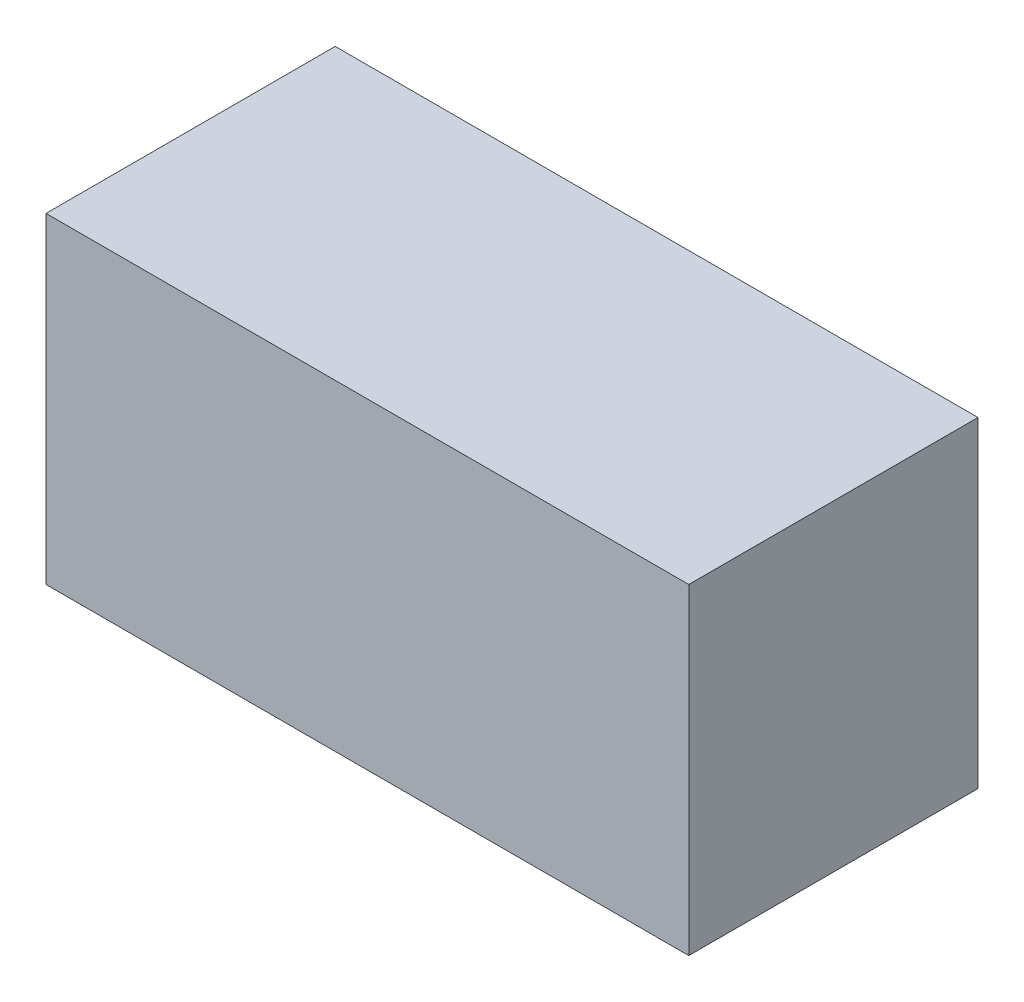
ISO-10303-21;
HEADER;
FILE_DESCRIPTION(('STEP AP214'),'2;1');
FILE_NAME('part.step','',(''),(''),'','','');
FILE_SCHEMA(('AUTOMOTIVE_DESIGN { 1 0 10303 214 1 1 1 1 }'));
ENDSEC;
DATA;
#1=APPLICATION_CONTEXT('core data for automotive mechanical design processes');
#2=APPLICATION_PROTOCOL_DEFINITION('international standard','automotive_design',2000,#1);
#3=PRODUCT_CONTEXT('',#1,'mechanical');
#4=PRODUCT('Part','Part','',(#3));
#5=PRODUCT_RELATED_PRODUCT_CATEGORY('part','',(#4));
#6=PRODUCT_DEFINITION_FORMATION('','',#4);
#7=PRODUCT_DEFINITION_CONTEXT('part definition',#1,'design');
#8=PRODUCT_DEFINITION('design','',#6,#7);
#9=PRODUCT_DEFINITION_SHAPE('','',#8);
#10=(LENGTH_UNIT() NAMED_UNIT(*) SI_UNIT(.MILLI.,.METRE.));
#11=(NAMED_UNIT(*) PLANE_ANGLE_UNIT() SI_UNIT($,.RADIAN.));
#12=(NAMED_UNIT(*) SI_UNIT($,.STERADIAN.) SOLID_ANGLE_UNIT());
#13=UNCERTAINTY_MEASURE_WITH_UNIT(LENGTH_MEASURE(1.E-05),#10,'distance_accuracy_value','');
#14=(GEOMETRIC_REPRESENTATION_CONTEXT(3) GLOBAL_UNCERTAINTY_ASSIGNED_CONTEXT((#13)) GLOBAL_UNIT_ASSIGNED_CONTEXT((#10,
#11,#12)) REPRESENTATION_CONTEXT('',''));
#15=CARTESIAN_POINT('',(0.,0.,0.));
#16=DIRECTION('',(0.,0.,1.));
#17=DIRECTION('',(1.,0.,0.));
#18=AXIS2_PLACEMENT_3D('',#15,#16,#17);
#19=CARTESIAN_POINT('',(1.,-0.5,0.9));
#20=DIRECTION('',(0.,1.,0.));
#21=DIRECTION('',(0.,0.,1.));
#22=AXIS2_PLACEMENT_3D('',#19,#20,#21);
#23=PLANE('',#22);
#24=DIRECTION('',(1.,0.,0.));
#25=VECTOR('',#24,1.);
#26=CARTESIAN_POINT('',(1.,-0.5,0.));
#27=LINE('',#26,#25);
#28=CARTESIAN_POINT('',(-1.,-0.5,0.));
#29=VERTEX_POINT('',#28);
#30=CARTESIAN_POINT('',(1.,-0.5,0.));
#31=VERTEX_POINT('',#30);
#32=EDGE_CURVE('E97',#29,#31,#27,.T.);
#33=ORIENTED_EDGE('',*,*,#32,.T.);
#34=DIRECTION('',(0.,0.,-1.));
#35=VECTOR('',#34,1.);
#36=CARTESIAN_POINT('',(1.,-0.5,0.9));
#37=LINE('',#36,#35);
#38=CARTESIAN_POINT('',(1.,-0.5,0.9));
#39=VERTEX_POINT('',#38);
#40=EDGE_CURVE('E11',#39,#31,#37,.T.);
#41=ORIENTED_EDGE('',*,*,#40,.F.);
#42=DIRECTION('',(1.,0.,0.));
#43=VECTOR('',#42,1.);
#44=CARTESIAN_POINT('',(1.,-0.5,0.9));
#45=LINE('',#44,#43);
#46=CARTESIAN_POINT('',(-1.,-0.5,0.9));
#47=VERTEX_POINT('',#46);
#48=EDGE_CURVE('E85',#47,#39,#45,.T.);
#49=ORIENTED_EDGE('',*,*,#48,.F.);
#50=DIRECTION('',(0.,0.,-1.));
#51=VECTOR('',#50,1.);
#52=CARTESIAN_POINT('',(-1.,-0.5,0.9));
#53=LINE('',#52,#51);
#54=EDGE_CURVE('E93',#47,#29,#53,.T.);
#55=ORIENTED_EDGE('',*,*,#54,.T.);
#56=EDGE_LOOP('',(#33,#41,#49,#55));
#57=FACE_BOUND('',#56,.T.);
#58=ADVANCED_FACE('F34',(#57),#23,.F.);
#59=CARTESIAN_POINT('',(1.,0.5,0.9));
#60=DIRECTION('',(-1.,0.,0.));
#61=DIRECTION('',(0.,0.,1.));
#62=AXIS2_PLACEMENT_3D('',#59,#60,#61);
#63=PLANE('',#62);
#64=DIRECTION('',(0.,1.,0.));
#65=VECTOR('',#64,1.);
#66=CARTESIAN_POINT('',(1.,0.5,0.));
#67=LINE('',#66,#65);
#68=CARTESIAN_POINT('',(1.,0.5,0.));
#69=VERTEX_POINT('',#68);
#70=EDGE_CURVE('E89',#31,#69,#67,.T.);
#71=ORIENTED_EDGE('',*,*,#70,.T.);
#72=DIRECTION('',(0.,0.,-1.));
#73=VECTOR('',#72,1.);
#74=CARTESIAN_POINT('',(1.,0.5,0.9));
#75=LINE('',#74,#73);
#76=CARTESIAN_POINT('',(1.,0.5,0.9));
#77=VERTEX_POINT('',#76);
#78=EDGE_CURVE('E42',#77,#69,#75,.T.);
#79=ORIENTED_EDGE('',*,*,#78,.F.);
#80=DIRECTION('',(0.,1.,0.));
#81=VECTOR('',#80,1.);
#82=CARTESIAN_POINT('',(1.,0.5,0.9));
#83=LINE('',#82,#81);
#84=EDGE_CURVE('E80',#39,#77,#83,.T.);
#85=ORIENTED_EDGE('',*,*,#84,.F.);
#86=ORIENTED_EDGE('',*,*,#40,.T.);
#87=EDGE_LOOP('',(#71,#79,#85,#86));
#88=FACE_BOUND('',#87,.T.);
#89=ADVANCED_FACE('F88',(#88),#63,.F.);
#90=CARTESIAN_POINT('',(-1.,0.5,0.9));
#91=DIRECTION('',(0.,-1.,0.));
#92=DIRECTION('',(0.,0.,-1.));
#93=AXIS2_PLACEMENT_3D('',#90,#91,#92);
#94=PLANE('',#93);
#95=DIRECTION('',(-1.,0.,0.));
#96=VECTOR('',#95,1.);
#97=CARTESIAN_POINT('',(-1.,0.5,0.));
#98=LINE('',#97,#96);
#99=CARTESIAN_POINT('',(-1.,0.5,0.));
#100=VERTEX_POINT('',#99);
#101=EDGE_CURVE('E67',#69,#100,#98,.T.);
#102=ORIENTED_EDGE('',*,*,#101,.T.);
#103=DIRECTION('',(0.,0.,-1.));
#104=VECTOR('',#103,1.);
#105=CARTESIAN_POINT('',(-1.,0.5,0.9));
#106=LINE('',#105,#104);
#107=CARTESIAN_POINT('',(-1.,0.5,0.9));
#108=VERTEX_POINT('',#107);
#109=EDGE_CURVE('E90',#108,#100,#106,.T.);
#110=ORIENTED_EDGE('',*,*,#109,.F.);
#111=DIRECTION('',(-1.,0.,0.));
#112=VECTOR('',#111,1.);
#113=CARTESIAN_POINT('',(-1.,0.5,0.9));
#114=LINE('',#113,#112);
#115=EDGE_CURVE('E83',#77,#108,#114,.T.);
#116=ORIENTED_EDGE('',*,*,#115,.F.);
#117=ORIENTED_EDGE('',*,*,#78,.T.);
#118=EDGE_LOOP('',(#102,#110,#116,#117));
#119=FACE_BOUND('',#118,.T.);
#120=ADVANCED_FACE('F91',(#119),#94,.F.);
#121=CARTESIAN_POINT('',(-1.,-0.5,0.9));
#122=DIRECTION('',(1.,0.,0.));
#123=DIRECTION('',(0.,0.,-1.));
#124=AXIS2_PLACEMENT_3D('',#121,#122,#123);
#125=PLANE('',#124);
#126=DIRECTION('',(0.,-1.,0.));
#127=VECTOR('',#126,1.);
#128=CARTESIAN_POINT('',(-1.,-0.5,0.));
#129=LINE('',#128,#127);
#130=EDGE_CURVE('E73',#100,#29,#129,.T.);
#131=ORIENTED_EDGE('',*,*,#130,.T.);
#132=ORIENTED_EDGE('',*,*,#54,.F.);
#133=DIRECTION('',(0.,-1.,0.));
#134=VECTOR('',#133,1.);
#135=CARTESIAN_POINT('',(-1.,-0.5,0.9));
#136=LINE('',#135,#134);
#137=EDGE_CURVE('E50',#108,#47,#136,.T.);
#138=ORIENTED_EDGE('',*,*,#137,.F.);
#139=ORIENTED_EDGE('',*,*,#109,.T.);
#140=EDGE_LOOP('',(#131,#132,#138,#139));
#141=FACE_BOUND('',#140,.T.);
#142=ADVANCED_FACE('F104',(#141),#125,.F.);
#143=CARTESIAN_POINT('',(0.,0.,0.9));
#144=DIRECTION('',(0.,0.,-1.));
#145=DIRECTION('',(-1.,0.,0.));
#146=AXIS2_PLACEMENT_3D('',#143,#144,#145);
#147=PLANE('',#146);
#148=ORIENTED_EDGE('',*,*,#48,.T.);
#149=ORIENTED_EDGE('',*,*,#84,.T.);
#150=ORIENTED_EDGE('',*,*,#115,.T.);
#151=ORIENTED_EDGE('',*,*,#137,.T.);
#152=EDGE_LOOP('',(#148,#149,#150,#151));
#153=FACE_BOUND('',#152,.T.);
#154=ADVANCED_FACE('F81',(#153),#147,.F.);
#155=CARTESIAN_POINT('',(0.,0.,0.));
#156=DIRECTION('',(0.,0.,-1.));
#157=DIRECTION('',(-1.,0.,0.));
#158=AXIS2_PLACEMENT_3D('',#155,#156,#157);
#159=PLANE('',#158);
#160=ORIENTED_EDGE('',*,*,#32,.F.);
#161=ORIENTED_EDGE('',*,*,#130,.F.);
#162=ORIENTED_EDGE('',*,*,#101,.F.);
#163=ORIENTED_EDGE('',*,*,#70,.F.);
#164=EDGE_LOOP('',(#160,#161,#162,#163));
#165=FACE_BOUND('',#164,.T.);
#166=ADVANCED_FACE('F107',(#165),#159,.T.);
#167=CLOSED_SHELL('',(#58,#89,#120,#142,#154,#166));
#168=MANIFOLD_SOLID_BREP('B2',#167);
#169=ADVANCED_BREP_SHAPE_REPRESENTATION('',(#18,#168),#14);
#170=SHAPE_DEFINITION_REPRESENTATION(#9,#169);
ENDSEC;
END-ISO-10303-21;
